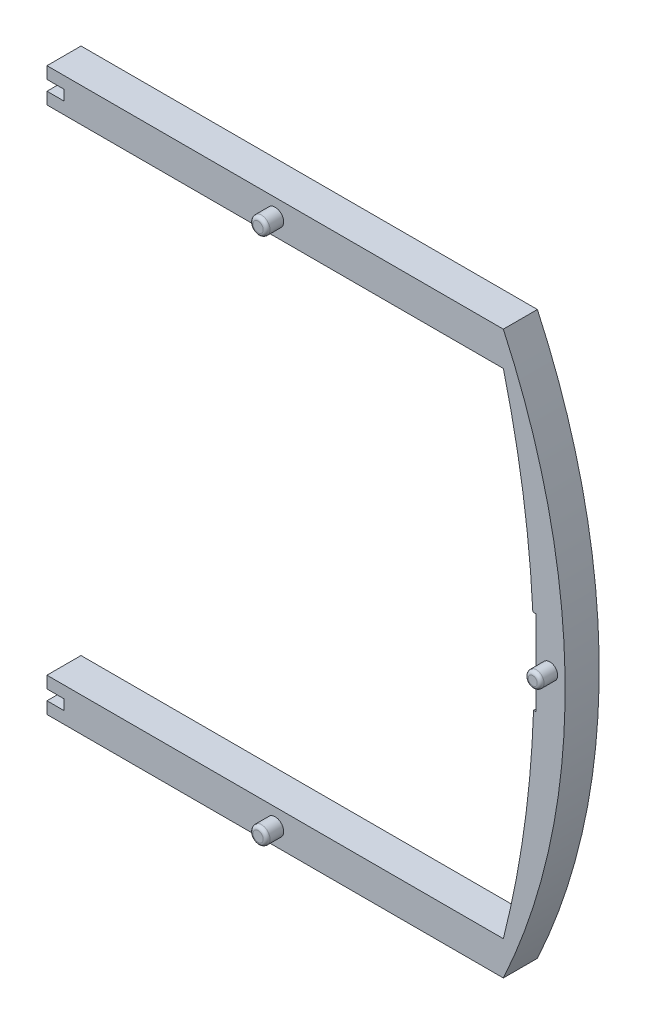
ISO-10303-21;
HEADER;
FILE_DESCRIPTION(('STEP AP214'),'2;1');
FILE_NAME('part.step','',(''),(''),'','','');
FILE_SCHEMA(('AUTOMOTIVE_DESIGN { 1 0 10303 214 1 1 1 1 }'));
ENDSEC;
DATA;
#1=APPLICATION_CONTEXT('core data for automotive mechanical design processes');
#2=APPLICATION_PROTOCOL_DEFINITION('international standard','automotive_design',2000,#1);
#3=PRODUCT_CONTEXT('',#1,'mechanical');
#4=PRODUCT('Part','Part','',(#3));
#5=PRODUCT_RELATED_PRODUCT_CATEGORY('part','',(#4));
#6=PRODUCT_DEFINITION_FORMATION('','',#4);
#7=PRODUCT_DEFINITION_CONTEXT('part definition',#1,'design');
#8=PRODUCT_DEFINITION('design','',#6,#7);
#9=PRODUCT_DEFINITION_SHAPE('','',#8);
#10=(LENGTH_UNIT() NAMED_UNIT(*) SI_UNIT(.MILLI.,.METRE.));
#11=(NAMED_UNIT(*) PLANE_ANGLE_UNIT() SI_UNIT($,.RADIAN.));
#12=(NAMED_UNIT(*) SI_UNIT($,.STERADIAN.) SOLID_ANGLE_UNIT());
#13=UNCERTAINTY_MEASURE_WITH_UNIT(LENGTH_MEASURE(1.E-05),#10,'distance_accuracy_value','');
#14=(GEOMETRIC_REPRESENTATION_CONTEXT(3) GLOBAL_UNCERTAINTY_ASSIGNED_CONTEXT((#13)) GLOBAL_UNIT_ASSIGNED_CONTEXT((#10,
#11,#12)) REPRESENTATION_CONTEXT('',''));
#15=CARTESIAN_POINT('',(0.,0.,0.));
#16=DIRECTION('',(0.,0.,1.));
#17=DIRECTION('',(1.,0.,0.));
#18=AXIS2_PLACEMENT_3D('',#15,#16,#17);
#19=CARTESIAN_POINT('',(0.,49.0251440135661,10.));
#20=DIRECTION('',(0.,1.,0.));
#21=DIRECTION('',(-1.,0.,0.));
#22=AXIS2_PLACEMENT_3D('',#19,#20,#21);
#23=PLANE('',#22);
#24=DIRECTION('',(1.,0.,0.));
#25=VECTOR('',#24,1.);
#26=CARTESIAN_POINT('',(0.,49.0251440135661,0.));
#27=LINE('',#26,#25);
#28=CARTESIAN_POINT('',(-18.7759866121896,49.0251440135661,0.));
#29=VERTEX_POINT('',#28);
#30=CARTESIAN_POINT('',(-13.7759866121896,49.0251440135661,0.));
#31=VERTEX_POINT('',#30);
#32=EDGE_CURVE('E230',#29,#31,#27,.T.);
#33=ORIENTED_EDGE('',*,*,#32,.T.);
#34=DIRECTION('',(0.,0.,-1.));
#35=VECTOR('',#34,1.);
#36=CARTESIAN_POINT('',(-13.7759866121896,49.0251440135661,10.));
#37=LINE('',#36,#35);
#38=CARTESIAN_POINT('',(-13.7759866121896,49.0251440135661,10.));
#39=VERTEX_POINT('',#38);
#40=EDGE_CURVE('E211',#39,#31,#37,.T.);
#41=ORIENTED_EDGE('',*,*,#40,.F.);
#42=DIRECTION('',(1.,0.,0.));
#43=VECTOR('',#42,1.);
#44=CARTESIAN_POINT('',(0.,49.0251440135661,10.));
#45=LINE('',#44,#43);
#46=CARTESIAN_POINT('',(-18.7759866121896,49.0251440135661,10.));
#47=VERTEX_POINT('',#46);
#48=EDGE_CURVE('E218',#47,#39,#45,.T.);
#49=ORIENTED_EDGE('',*,*,#48,.F.);
#50=DIRECTION('',(0.,0.,-1.));
#51=VECTOR('',#50,1.);
#52=CARTESIAN_POINT('',(-18.7759866121896,49.0251440135661,10.));
#53=LINE('',#52,#51);
#54=EDGE_CURVE('E351',#47,#29,#53,.T.);
#55=ORIENTED_EDGE('',*,*,#54,.T.);
#56=EDGE_LOOP('',(#33,#41,#49,#55));
#57=FACE_BOUND('',#56,.T.);
#58=ADVANCED_FACE('F35',(#57),#23,.F.);
#59=CARTESIAN_POINT('',(-13.7759866121896,0.,10.));
#60=DIRECTION('',(1.,0.,0.));
#61=DIRECTION('',(0.,0.,-1.));
#62=AXIS2_PLACEMENT_3D('',#59,#60,#61);
#63=PLANE('',#62);
#64=DIRECTION('',(0.,-1.,0.));
#65=VECTOR('',#64,1.);
#66=CARTESIAN_POINT('',(-13.7759866121896,0.,0.));
#67=LINE('',#66,#65);
#68=CARTESIAN_POINT('',(-13.7759866121896,46.0251440135661,0.));
#69=VERTEX_POINT('',#68);
#70=EDGE_CURVE('E353',#31,#69,#67,.T.);
#71=ORIENTED_EDGE('',*,*,#70,.T.);
#72=DIRECTION('',(0.,0.,-1.));
#73=VECTOR('',#72,1.);
#74=CARTESIAN_POINT('',(-13.7759866121896,46.0251440135661,10.));
#75=LINE('',#74,#73);
#76=CARTESIAN_POINT('',(-13.7759866121896,46.0251440135661,10.));
#77=VERTEX_POINT('',#76);
#78=EDGE_CURVE('E213',#77,#69,#75,.T.);
#79=ORIENTED_EDGE('',*,*,#78,.F.);
#80=DIRECTION('',(0.,-1.,0.));
#81=VECTOR('',#80,1.);
#82=CARTESIAN_POINT('',(-13.7759866121896,0.,10.));
#83=LINE('',#82,#81);
#84=EDGE_CURVE('E206',#39,#77,#83,.T.);
#85=ORIENTED_EDGE('',*,*,#84,.F.);
#86=ORIENTED_EDGE('',*,*,#40,.T.);
#87=EDGE_LOOP('',(#71,#79,#85,#86));
#88=FACE_BOUND('',#87,.T.);
#89=ADVANCED_FACE('F209',(#88),#63,.F.);
#90=CARTESIAN_POINT('',(0.,46.0251440135661,10.));
#91=DIRECTION('',(0.,1.,0.));
#92=DIRECTION('',(0.,0.,1.));
#93=AXIS2_PLACEMENT_3D('',#90,#91,#92);
#94=PLANE('',#93);
#95=DIRECTION('',(1.,0.,0.));
#96=VECTOR('',#95,1.);
#97=CARTESIAN_POINT('',(0.,46.0251440135661,0.));
#98=LINE('',#97,#96);
#99=CARTESIAN_POINT('',(-18.7759866121896,46.0251440135661,0.));
#100=VERTEX_POINT('',#99);
#101=EDGE_CURVE('E355',#100,#69,#98,.T.);
#102=ORIENTED_EDGE('',*,*,#101,.F.);
#103=DIRECTION('',(0.,0.,-1.));
#104=VECTOR('',#103,1.);
#105=CARTESIAN_POINT('',(-18.7759866121896,46.0251440135661,10.));
#106=LINE('',#105,#104);
#107=CARTESIAN_POINT('',(-18.7759866121896,46.0251440135661,10.));
#108=VERTEX_POINT('',#107);
#109=EDGE_CURVE('E236',#108,#100,#106,.T.);
#110=ORIENTED_EDGE('',*,*,#109,.F.);
#111=DIRECTION('',(1.,0.,0.));
#112=VECTOR('',#111,1.);
#113=CARTESIAN_POINT('',(0.,46.0251440135661,10.));
#114=LINE('',#113,#112);
#115=EDGE_CURVE('E217',#108,#77,#114,.T.);
#116=ORIENTED_EDGE('',*,*,#115,.T.);
#117=ORIENTED_EDGE('',*,*,#78,.T.);
#118=EDGE_LOOP('',(#102,#110,#116,#117));
#119=FACE_BOUND('',#118,.T.);
#120=ADVANCED_FACE('F435',(#119),#94,.T.);
#121=CARTESIAN_POINT('',(-18.7759866121896,0.,10.));
#122=DIRECTION('',(-1.,0.,0.));
#123=DIRECTION('',(0.,0.,1.));
#124=AXIS2_PLACEMENT_3D('',#121,#122,#123);
#125=PLANE('',#124);
#126=DIRECTION('',(0.,1.,0.));
#127=VECTOR('',#126,1.);
#128=CARTESIAN_POINT('',(-18.7759866121896,0.,0.));
#129=LINE('',#128,#127);
#130=CARTESIAN_POINT('',(-18.7759866121896,42.5251440135662,0.));
#131=VERTEX_POINT('',#130);
#132=EDGE_CURVE('E358',#131,#100,#129,.T.);
#133=ORIENTED_EDGE('',*,*,#132,.F.);
#134=DIRECTION('',(0.,0.,-1.));
#135=VECTOR('',#134,1.);
#136=CARTESIAN_POINT('',(-18.7759866121896,42.5251440135662,10.));
#137=LINE('',#136,#135);
#138=CARTESIAN_POINT('',(-18.7759866121896,42.5251440135662,10.));
#139=VERTEX_POINT('',#138);
#140=EDGE_CURVE('E428',#139,#131,#137,.T.);
#141=ORIENTED_EDGE('',*,*,#140,.F.);
#142=DIRECTION('',(0.,1.,0.));
#143=VECTOR('',#142,1.);
#144=CARTESIAN_POINT('',(-18.7759866121896,0.,10.));
#145=LINE('',#144,#143);
#146=EDGE_CURVE('E307',#139,#108,#145,.T.);
#147=ORIENTED_EDGE('',*,*,#146,.T.);
#148=ORIENTED_EDGE('',*,*,#109,.T.);
#149=EDGE_LOOP('',(#133,#141,#147,#148));
#150=FACE_BOUND('',#149,.T.);
#151=ADVANCED_FACE('F432',(#150),#125,.T.);
#152=CARTESIAN_POINT('',(0.,42.5251440135662,10.));
#153=DIRECTION('',(0.,1.,0.));
#154=DIRECTION('',(0.,0.,1.));
#155=AXIS2_PLACEMENT_3D('',#152,#153,#154);
#156=PLANE('',#155);
#157=DIRECTION('',(1.,0.,0.));
#158=VECTOR('',#157,1.);
#159=CARTESIAN_POINT('',(0.,42.5251440135662,0.));
#160=LINE('',#159,#158);
#161=CARTESIAN_POINT('',(115.22401338781,42.5251440135662,0.));
#162=VERTEX_POINT('',#161);
#163=EDGE_CURVE('E361',#131,#162,#160,.T.);
#164=ORIENTED_EDGE('',*,*,#163,.T.);
#165=DIRECTION('',(0.,0.,-1.));
#166=VECTOR('',#165,1.);
#167=CARTESIAN_POINT('',(115.22401338781,42.5251440135662,10.));
#168=LINE('',#167,#166);
#169=CARTESIAN_POINT('',(115.22401338781,42.5251440135662,10.));
#170=VERTEX_POINT('',#169);
#171=EDGE_CURVE('E426',#170,#162,#168,.T.);
#172=ORIENTED_EDGE('',*,*,#171,.F.);
#173=DIRECTION('',(1.,0.,0.));
#174=VECTOR('',#173,1.);
#175=CARTESIAN_POINT('',(0.,42.5251440135662,10.));
#176=LINE('',#175,#174);
#177=EDGE_CURVE('E310',#139,#170,#176,.T.);
#178=ORIENTED_EDGE('',*,*,#177,.F.);
#179=ORIENTED_EDGE('',*,*,#140,.T.);
#180=EDGE_LOOP('',(#164,#172,#178,#179));
#181=FACE_BOUND('',#180,.T.);
#182=ADVANCED_FACE('F439',(#181),#156,.F.);
#183=CARTESIAN_POINT('',(-171.126393016435,-29.9748559864339,10.));
#184=DIRECTION('',(0.,0.,-1.));
#185=DIRECTION('',(-1.,0.,0.));
#186=AXIS2_PLACEMENT_3D('',#183,#184,#185);
#187=CYLINDRICAL_SURFACE('',#186,295.385858239484);
#188=CARTESIAN_POINT('',(-171.126393016435,-29.9748559864339,0.));
#189=DIRECTION('',(0.,0.,1.));
#190=DIRECTION('',(1.,0.,0.));
#191=AXIS2_PLACEMENT_3D('',#188,#189,#190);
#192=CIRCLE('',#191,295.385858239484);
#193=CARTESIAN_POINT('',(123.882639825974,-15.0592336640898,0.));
#194=VERTEX_POINT('',#193);
#195=EDGE_CURVE('E364',#194,#162,#192,.T.);
#196=ORIENTED_EDGE('',*,*,#195,.F.);
#197=DIRECTION('',(0.,0.,-1.));
#198=VECTOR('',#197,1.);
#199=CARTESIAN_POINT('',(123.882639825974,-15.0592336640898,10.));
#200=LINE('',#199,#198);
#201=CARTESIAN_POINT('',(123.882639825974,-15.0592336640898,2.));
#202=VERTEX_POINT('',#201);
#203=EDGE_CURVE('E301',#194,#202,#200,.F.);
#204=ORIENTED_EDGE('',*,*,#203,.T.);
#205=DIRECTION('',(0.,0.,-1.));
#206=VECTOR('',#205,1.);
#207=CARTESIAN_POINT('',(123.882639825974,-15.0592336640898,10.));
#208=LINE('',#207,#206);
#209=CARTESIAN_POINT('',(123.882639825974,-15.0592336640898,10.));
#210=VERTEX_POINT('',#209);
#211=EDGE_CURVE('E423',#210,#202,#208,.T.);
#212=ORIENTED_EDGE('',*,*,#211,.F.);
#213=CARTESIAN_POINT('',(-171.126393016435,-29.9748559864339,10.));
#214=DIRECTION('',(0.,0.,1.));
#215=DIRECTION('',(1.,0.,0.));
#216=AXIS2_PLACEMENT_3D('',#213,#214,#215);
#217=CIRCLE('',#216,295.385858239484);
#218=EDGE_CURVE('E312',#210,#170,#217,.T.);
#219=ORIENTED_EDGE('',*,*,#218,.T.);
#220=ORIENTED_EDGE('',*,*,#171,.T.);
#221=EDGE_LOOP('',(#196,#204,#212,#219,#220));
#222=FACE_BOUND('',#221,.T.);
#223=ADVANCED_FACE('F552',(#222),#187,.F.);
#224=CARTESIAN_POINT('',(0.,-15.0592336640898,10.));
#225=DIRECTION('',(0.,-1.,0.));
#226=DIRECTION('',(0.,0.,-1.));
#227=AXIS2_PLACEMENT_3D('',#224,#225,#226);
#228=PLANE('',#227);
#229=DIRECTION('',(-1.,0.,0.));
#230=VECTOR('',#229,1.);
#231=CARTESIAN_POINT('',(124.791681136578,-15.0592336640898,2.));
#232=LINE('',#231,#230);
#233=CARTESIAN_POINT('',(124.791681136578,-15.0592336640898,2.));
#234=VERTEX_POINT('',#233);
#235=EDGE_CURVE('E293',#234,#202,#232,.T.);
#236=ORIENTED_EDGE('',*,*,#235,.F.);
#237=DIRECTION('',(0.,0.,-1.));
#238=VECTOR('',#237,1.);
#239=CARTESIAN_POINT('',(124.791681136578,-15.0592336640898,10.));
#240=LINE('',#239,#238);
#241=CARTESIAN_POINT('',(124.791681136578,-15.0592336640898,10.));
#242=VERTEX_POINT('',#241);
#243=EDGE_CURVE('E420',#242,#234,#240,.T.);
#244=ORIENTED_EDGE('',*,*,#243,.F.);
#245=DIRECTION('',(-1.,0.,0.));
#246=VECTOR('',#245,1.);
#247=CARTESIAN_POINT('',(0.,-15.0592336640898,10.));
#248=LINE('',#247,#246);
#249=EDGE_CURVE('E315',#242,#210,#248,.T.);
#250=ORIENTED_EDGE('',*,*,#249,.T.);
#251=ORIENTED_EDGE('',*,*,#211,.T.);
#252=EDGE_LOOP('',(#236,#244,#250,#251));
#253=FACE_BOUND('',#252,.T.);
#254=ADVANCED_FACE('F445',(#253),#228,.T.);
#255=CARTESIAN_POINT('',(124.791681136578,0.,10.));
#256=DIRECTION('',(1.,0.,0.));
#257=DIRECTION('',(0.,0.,-1.));
#258=AXIS2_PLACEMENT_3D('',#255,#256,#257);
#259=PLANE('',#258);
#260=ORIENTED_EDGE('',*,*,#243,.T.);
#261=DIRECTION('',(0.,-1.,0.));
#262=VECTOR('',#261,1.);
#263=CARTESIAN_POINT('',(124.791681136578,-15.0592336640898,2.));
#264=LINE('',#263,#262);
#265=CARTESIAN_POINT('',(124.791681136578,-39.9748559864338,2.));
#266=VERTEX_POINT('',#265);
#267=EDGE_CURVE('E298',#234,#266,#264,.T.);
#268=ORIENTED_EDGE('',*,*,#267,.T.);
#269=DIRECTION('',(0.,0.,-1.));
#270=VECTOR('',#269,1.);
#271=CARTESIAN_POINT('',(124.791681136578,-39.9748559864338,10.));
#272=LINE('',#271,#270);
#273=CARTESIAN_POINT('',(124.791681136578,-39.9748559864338,10.));
#274=VERTEX_POINT('',#273);
#275=EDGE_CURVE('E417',#274,#266,#272,.T.);
#276=ORIENTED_EDGE('',*,*,#275,.F.);
#277=DIRECTION('',(0.,-1.,0.));
#278=VECTOR('',#277,1.);
#279=CARTESIAN_POINT('',(124.791681136578,0.,10.));
#280=LINE('',#279,#278);
#281=EDGE_CURVE('E319',#242,#274,#280,.T.);
#282=ORIENTED_EDGE('',*,*,#281,.F.);
#283=EDGE_LOOP('',(#260,#268,#276,#282));
#284=FACE_BOUND('',#283,.T.);
#285=ADVANCED_FACE('F451',(#284),#259,.F.);
#286=CARTESIAN_POINT('',(0.,-39.9748559864338,10.));
#287=DIRECTION('',(0.,-1.,0.));
#288=DIRECTION('',(0.,0.,-1.));
#289=AXIS2_PLACEMENT_3D('',#286,#287,#288);
#290=PLANE('',#289);
#291=ORIENTED_EDGE('',*,*,#275,.T.);
#292=DIRECTION('',(-1.,0.,0.));
#293=VECTOR('',#292,1.);
#294=CARTESIAN_POINT('',(124.791681136578,-39.9748559864338,2.));
#295=LINE('',#294,#293);
#296=CARTESIAN_POINT('',(124.090146574213,-39.9748559864338,2.));
#297=VERTEX_POINT('',#296);
#298=EDGE_CURVE('E460',#266,#297,#295,.T.);
#299=ORIENTED_EDGE('',*,*,#298,.T.);
#300=DIRECTION('',(0.,0.,-1.));
#301=VECTOR('',#300,1.);
#302=CARTESIAN_POINT('',(124.090146574213,-39.9748559864338,10.));
#303=LINE('',#302,#301);
#304=CARTESIAN_POINT('',(124.090146574213,-39.9748559864338,10.));
#305=VERTEX_POINT('',#304);
#306=EDGE_CURVE('E414',#305,#297,#303,.T.);
#307=ORIENTED_EDGE('',*,*,#306,.F.);
#308=DIRECTION('',(-1.,0.,0.));
#309=VECTOR('',#308,1.);
#310=CARTESIAN_POINT('',(0.,-39.9748559864338,10.));
#311=LINE('',#310,#309);
#312=EDGE_CURVE('E321',#274,#305,#311,.T.);
#313=ORIENTED_EDGE('',*,*,#312,.F.);
#314=EDGE_LOOP('',(#291,#299,#307,#313));
#315=FACE_BOUND('',#314,.T.);
#316=ADVANCED_FACE('F458',(#315),#290,.F.);
#317=CARTESIAN_POINT('',(115.22401338781,-102.474855986434,0.));
#318=VERTEX_POINT('',#317);
#319=CARTESIAN_POINT('',(124.090146574213,-39.9748559864338,0.));
#320=VERTEX_POINT('',#319);
#321=EDGE_CURVE('E290',#318,#320,#192,.T.);
#322=ORIENTED_EDGE('',*,*,#321,.F.);
#323=DIRECTION('',(0.,0.,-1.));
#324=VECTOR('',#323,1.);
#325=CARTESIAN_POINT('',(115.22401338781,-102.474855986434,10.));
#326=LINE('',#325,#324);
#327=CARTESIAN_POINT('',(115.22401338781,-102.474855986434,10.));
#328=VERTEX_POINT('',#327);
#329=EDGE_CURVE('E412',#328,#318,#326,.T.);
#330=ORIENTED_EDGE('',*,*,#329,.F.);
#331=EDGE_CURVE('E316',#328,#305,#217,.T.);
#332=ORIENTED_EDGE('',*,*,#331,.T.);
#333=ORIENTED_EDGE('',*,*,#306,.T.);
#334=DIRECTION('',(0.,0.,-1.));
#335=VECTOR('',#334,1.);
#336=CARTESIAN_POINT('',(124.090146574213,-39.9748559864338,10.));
#337=LINE('',#336,#335);
#338=EDGE_CURVE('E277',#320,#297,#337,.F.);
#339=ORIENTED_EDGE('',*,*,#338,.F.);
#340=EDGE_LOOP('',(#322,#330,#332,#333,#339));
#341=FACE_BOUND('',#340,.T.);
#342=ADVANCED_FACE('F462',(#341),#187,.F.);
#343=CARTESIAN_POINT('',(0.,-102.474855986434,10.));
#344=DIRECTION('',(0.,1.,0.));
#345=DIRECTION('',(-1.,0.,0.));
#346=AXIS2_PLACEMENT_3D('',#343,#344,#345);
#347=PLANE('',#346);
#348=DIRECTION('',(1.,0.,0.));
#349=VECTOR('',#348,1.);
#350=CARTESIAN_POINT('',(0.,-102.474855986434,0.));
#351=LINE('',#350,#349);
#352=CARTESIAN_POINT('',(-18.7877563106144,-102.474855986434,0.));
#353=VERTEX_POINT('',#352);
#354=EDGE_CURVE('E367',#353,#318,#351,.T.);
#355=ORIENTED_EDGE('',*,*,#354,.F.);
#356=DIRECTION('',(0.,0.,-1.));
#357=VECTOR('',#356,1.);
#358=CARTESIAN_POINT('',(-18.7877563106144,-102.474855986434,10.));
#359=LINE('',#358,#357);
#360=CARTESIAN_POINT('',(-18.7877563106144,-102.474855986434,10.));
#361=VERTEX_POINT('',#360);
#362=EDGE_CURVE('E410',#361,#353,#359,.T.);
#363=ORIENTED_EDGE('',*,*,#362,.F.);
#364=DIRECTION('',(1.,0.,0.));
#365=VECTOR('',#364,1.);
#366=CARTESIAN_POINT('',(0.,-102.474855986434,10.));
#367=LINE('',#366,#365);
#368=EDGE_CURVE('E323',#361,#328,#367,.T.);
#369=ORIENTED_EDGE('',*,*,#368,.T.);
#370=ORIENTED_EDGE('',*,*,#329,.T.);
#371=EDGE_LOOP('',(#355,#363,#369,#370));
#372=FACE_BOUND('',#371,.T.);
#373=ADVANCED_FACE('F465',(#372),#347,.T.);
#374=CARTESIAN_POINT('',(-19.1321394317428,-0.0643370032374166,10.));
#375=DIRECTION('',(0.999994345933626,0.00336275196515592,0.));
#376=DIRECTION('',(-0.00336275196515592,0.999994345933626,0.));
#377=AXIS2_PLACEMENT_3D('',#374,#375,#376);
#378=PLANE('',#377);
#379=DIRECTION('',(0.00336275196515592,-0.999994345933626,0.));
#380=VECTOR('',#379,1.);
#381=CARTESIAN_POINT('',(-19.1321394317428,-0.0643370032374166,0.));
#382=LINE('',#381,#380);
#383=CARTESIAN_POINT('',(-18.7759866121897,-105.974855986434,0.));
#384=VERTEX_POINT('',#383);
#385=EDGE_CURVE('E369',#353,#384,#382,.T.);
#386=ORIENTED_EDGE('',*,*,#385,.T.);
#387=DIRECTION('',(0.,0.,-1.));
#388=VECTOR('',#387,1.);
#389=CARTESIAN_POINT('',(-18.7759866121897,-105.974855986434,10.));
#390=LINE('',#389,#388);
#391=CARTESIAN_POINT('',(-18.7759866121897,-105.974855986434,10.));
#392=VERTEX_POINT('',#391);
#393=EDGE_CURVE('E407',#392,#384,#390,.T.);
#394=ORIENTED_EDGE('',*,*,#393,.F.);
#395=DIRECTION('',(0.00336275196515592,-0.999994345933626,0.));
#396=VECTOR('',#395,1.);
#397=CARTESIAN_POINT('',(-19.1321394317428,-0.0643370032374166,10.));
#398=LINE('',#397,#396);
#399=EDGE_CURVE('E326',#361,#392,#398,.T.);
#400=ORIENTED_EDGE('',*,*,#399,.F.);
#401=ORIENTED_EDGE('',*,*,#362,.T.);
#402=EDGE_LOOP('',(#386,#394,#400,#401));
#403=FACE_BOUND('',#402,.T.);
#404=ADVANCED_FACE('F471',(#403),#378,.F.);
#405=CARTESIAN_POINT('',(0.,-105.974855986434,10.));
#406=DIRECTION('',(0.,1.,0.));
#407=DIRECTION('',(0.,0.,1.));
#408=AXIS2_PLACEMENT_3D('',#405,#406,#407);
#409=PLANE('',#408);
#410=DIRECTION('',(1.,0.,0.));
#411=VECTOR('',#410,1.);
#412=CARTESIAN_POINT('',(0.,-105.974855986434,0.));
#413=LINE('',#412,#411);
#414=CARTESIAN_POINT('',(-13.7759866121897,-105.974855986434,0.));
#415=VERTEX_POINT('',#414);
#416=EDGE_CURVE('E371',#384,#415,#413,.T.);
#417=ORIENTED_EDGE('',*,*,#416,.T.);
#418=DIRECTION('',(0.,0.,-1.));
#419=VECTOR('',#418,1.);
#420=CARTESIAN_POINT('',(-13.7759866121897,-105.974855986434,10.));
#421=LINE('',#420,#419);
#422=CARTESIAN_POINT('',(-13.7759866121897,-105.974855986434,10.));
#423=VERTEX_POINT('',#422);
#424=EDGE_CURVE('E404',#423,#415,#421,.T.);
#425=ORIENTED_EDGE('',*,*,#424,.F.);
#426=DIRECTION('',(1.,0.,0.));
#427=VECTOR('',#426,1.);
#428=CARTESIAN_POINT('',(0.,-105.974855986434,10.));
#429=LINE('',#428,#427);
#430=EDGE_CURVE('E328',#392,#423,#429,.T.);
#431=ORIENTED_EDGE('',*,*,#430,.F.);
#432=ORIENTED_EDGE('',*,*,#393,.T.);
#433=EDGE_LOOP('',(#417,#425,#431,#432));
#434=FACE_BOUND('',#433,.T.);
#435=ADVANCED_FACE('F475',(#434),#409,.F.);
#436=CARTESIAN_POINT('',(-13.7759866121897,0.,10.));
#437=DIRECTION('',(1.,0.,0.));
#438=DIRECTION('',(0.,0.,-1.));
#439=AXIS2_PLACEMENT_3D('',#436,#437,#438);
#440=PLANE('',#439);
#441=DIRECTION('',(0.,-1.,0.));
#442=VECTOR('',#441,1.);
#443=CARTESIAN_POINT('',(-13.7759866121897,0.,0.));
#444=LINE('',#443,#442);
#445=CARTESIAN_POINT('',(-13.7759866121897,-108.974855986434,0.));
#446=VERTEX_POINT('',#445);
#447=EDGE_CURVE('E373',#415,#446,#444,.T.);
#448=ORIENTED_EDGE('',*,*,#447,.T.);
#449=DIRECTION('',(0.,0.,-1.));
#450=VECTOR('',#449,1.);
#451=CARTESIAN_POINT('',(-13.7759866121897,-108.974855986434,10.));
#452=LINE('',#451,#450);
#453=CARTESIAN_POINT('',(-13.7759866121897,-108.974855986434,10.));
#454=VERTEX_POINT('',#453);
#455=EDGE_CURVE('E402',#454,#446,#452,.T.);
#456=ORIENTED_EDGE('',*,*,#455,.F.);
#457=DIRECTION('',(0.,-1.,0.));
#458=VECTOR('',#457,1.);
#459=CARTESIAN_POINT('',(-13.7759866121897,0.,10.));
#460=LINE('',#459,#458);
#461=EDGE_CURVE('E330',#423,#454,#460,.T.);
#462=ORIENTED_EDGE('',*,*,#461,.F.);
#463=ORIENTED_EDGE('',*,*,#424,.T.);
#464=EDGE_LOOP('',(#448,#456,#462,#463));
#465=FACE_BOUND('',#464,.T.);
#466=ADVANCED_FACE('F480',(#465),#440,.F.);
#467=CARTESIAN_POINT('',(3.02465985553373E-13,-108.974855986434,10.));
#468=DIRECTION('',(0.,1.,0.));
#469=DIRECTION('',(-1.,0.,0.));
#470=AXIS2_PLACEMENT_3D('',#467,#468,#469);
#471=PLANE('',#470);
#472=DIRECTION('',(1.,0.,0.));
#473=VECTOR('',#472,1.);
#474=CARTESIAN_POINT('',(3.02465985553373E-13,-108.974855986434,0.));
#475=LINE('',#474,#473);
#476=CARTESIAN_POINT('',(-18.7759866121897,-108.974855986434,0.));
#477=VERTEX_POINT('',#476);
#478=EDGE_CURVE('E376',#477,#446,#475,.T.);
#479=ORIENTED_EDGE('',*,*,#478,.F.);
#480=DIRECTION('',(0.,0.,-1.));
#481=VECTOR('',#480,1.);
#482=CARTESIAN_POINT('',(-18.7759866121897,-108.974855986434,10.));
#483=LINE('',#482,#481);
#484=CARTESIAN_POINT('',(-18.7759866121897,-108.974855986434,10.));
#485=VERTEX_POINT('',#484);
#486=EDGE_CURVE('E400',#485,#477,#483,.T.);
#487=ORIENTED_EDGE('',*,*,#486,.F.);
#488=DIRECTION('',(1.,0.,0.));
#489=VECTOR('',#488,1.);
#490=CARTESIAN_POINT('',(3.02465985553373E-13,-108.974855986434,10.));
#491=LINE('',#490,#489);
#492=EDGE_CURVE('E332',#485,#454,#491,.T.);
#493=ORIENTED_EDGE('',*,*,#492,.T.);
#494=ORIENTED_EDGE('',*,*,#455,.T.);
#495=EDGE_LOOP('',(#479,#487,#493,#494));
#496=FACE_BOUND('',#495,.T.);
#497=ADVANCED_FACE('F487',(#496),#471,.T.);
#498=CARTESIAN_POINT('',(-18.4093209522831,0.0619063302319762,10.));
#499=DIRECTION('',(0.999994345933626,-0.00336275196515593,0.));
#500=DIRECTION('',(0.00336275196515593,0.999994345933626,0.));
#501=AXIS2_PLACEMENT_3D('',#498,#499,#500);
#502=PLANE('',#501);
#503=DIRECTION('',(-0.00336275196515593,-0.999994345933626,0.));
#504=VECTOR('',#503,1.);
#505=CARTESIAN_POINT('',(-18.4093209522831,0.0619063302319762,0.));
#506=LINE('',#505,#504);
#507=CARTESIAN_POINT('',(-18.7877563106144,-112.474855986434,0.));
#508=VERTEX_POINT('',#507);
#509=EDGE_CURVE('E379',#477,#508,#506,.T.);
#510=ORIENTED_EDGE('',*,*,#509,.T.);
#511=DIRECTION('',(0.,0.,-1.));
#512=VECTOR('',#511,1.);
#513=CARTESIAN_POINT('',(-18.7877563106144,-112.474855986434,10.));
#514=LINE('',#513,#512);
#515=CARTESIAN_POINT('',(-18.7877563106144,-112.474855986434,10.));
#516=VERTEX_POINT('',#515);
#517=EDGE_CURVE('E398',#516,#508,#514,.T.);
#518=ORIENTED_EDGE('',*,*,#517,.F.);
#519=DIRECTION('',(-0.00336275196515593,-0.999994345933626,0.));
#520=VECTOR('',#519,1.);
#521=CARTESIAN_POINT('',(-18.4093209522831,0.0619063302319762,10.));
#522=LINE('',#521,#520);
#523=EDGE_CURVE('E335',#485,#516,#522,.T.);
#524=ORIENTED_EDGE('',*,*,#523,.F.);
#525=ORIENTED_EDGE('',*,*,#486,.T.);
#526=EDGE_LOOP('',(#510,#518,#524,#525));
#527=FACE_BOUND('',#526,.T.);
#528=ADVANCED_FACE('F490',(#527),#502,.F.);
#529=CARTESIAN_POINT('',(0.,-112.474855986434,10.));
#530=DIRECTION('',(0.,-1.,0.));
#531=DIRECTION('',(1.,0.,0.));
#532=AXIS2_PLACEMENT_3D('',#529,#530,#531);
#533=PLANE('',#532);
#534=DIRECTION('',(-1.,0.,0.));
#535=VECTOR('',#534,1.);
#536=CARTESIAN_POINT('',(0.,-112.474855986434,0.));
#537=LINE('',#536,#535);
#538=CARTESIAN_POINT('',(115.22401338781,-112.474855986434,0.));
#539=VERTEX_POINT('',#538);
#540=EDGE_CURVE('E382',#539,#508,#537,.T.);
#541=ORIENTED_EDGE('',*,*,#540,.F.);
#542=DIRECTION('',(0.,0.,-1.));
#543=VECTOR('',#542,1.);
#544=CARTESIAN_POINT('',(115.22401338781,-112.474855986434,10.));
#545=LINE('',#544,#543);
#546=CARTESIAN_POINT('',(115.22401338781,-112.474855986434,10.));
#547=VERTEX_POINT('',#546);
#548=EDGE_CURVE('E396',#547,#539,#545,.T.);
#549=ORIENTED_EDGE('',*,*,#548,.F.);
#550=DIRECTION('',(-1.,0.,0.));
#551=VECTOR('',#550,1.);
#552=CARTESIAN_POINT('',(0.,-112.474855986434,10.));
#553=LINE('',#552,#551);
#554=EDGE_CURVE('E337',#547,#516,#553,.T.);
#555=ORIENTED_EDGE('',*,*,#554,.T.);
#556=ORIENTED_EDGE('',*,*,#517,.T.);
#557=EDGE_LOOP('',(#541,#549,#555,#556));
#558=FACE_BOUND('',#557,.T.);
#559=ADVANCED_FACE('F493',(#558),#533,.T.);
#560=CARTESIAN_POINT('',(-63.2147688535979,-29.9748559864339,10.));
#561=DIRECTION('',(0.,0.,-1.));
#562=DIRECTION('',(-1.,0.,0.));
#563=AXIS2_PLACEMENT_3D('',#560,#561,#562);
#564=CYLINDRICAL_SURFACE('',#563,196.587509796011);
#565=CARTESIAN_POINT('',(-63.2147688535979,-29.9748559864339,0.));
#566=DIRECTION('',(0.,0.,1.));
#567=DIRECTION('',(1.,0.,0.));
#568=AXIS2_PLACEMENT_3D('',#565,#566,#567);
#569=CIRCLE('',#568,196.587509796011);
#570=CARTESIAN_POINT('',(115.22401338781,52.5251440135662,0.));
#571=VERTEX_POINT('',#570);
#572=EDGE_CURVE('E385',#571,#539,#569,.F.);
#573=ORIENTED_EDGE('',*,*,#572,.F.);
#574=DIRECTION('',(0.,0.,-1.));
#575=VECTOR('',#574,1.);
#576=CARTESIAN_POINT('',(115.22401338781,52.5251440135662,10.));
#577=LINE('',#576,#575);
#578=CARTESIAN_POINT('',(115.22401338781,52.5251440135662,10.));
#579=VERTEX_POINT('',#578);
#580=EDGE_CURVE('E394',#579,#571,#577,.T.);
#581=ORIENTED_EDGE('',*,*,#580,.F.);
#582=CARTESIAN_POINT('',(-63.2147688535979,-29.9748559864339,10.));
#583=DIRECTION('',(0.,0.,1.));
#584=DIRECTION('',(1.,0.,0.));
#585=AXIS2_PLACEMENT_3D('',#582,#583,#584);
#586=CIRCLE('',#585,196.587509796011);
#587=EDGE_CURVE('E340',#579,#547,#586,.F.);
#588=ORIENTED_EDGE('',*,*,#587,.T.);
#589=ORIENTED_EDGE('',*,*,#548,.T.);
#590=EDGE_LOOP('',(#573,#581,#588,#589));
#591=FACE_BOUND('',#590,.T.);
#592=ADVANCED_FACE('F497',(#591),#564,.T.);
#593=CARTESIAN_POINT('',(0.,52.5251440135661,10.));
#594=DIRECTION('',(0.,-1.,0.));
#595=DIRECTION('',(1.,0.,0.));
#596=AXIS2_PLACEMENT_3D('',#593,#594,#595);
#597=PLANE('',#596);
#598=DIRECTION('',(-1.,0.,0.));
#599=VECTOR('',#598,1.);
#600=CARTESIAN_POINT('',(0.,52.5251440135661,0.));
#601=LINE('',#600,#599);
#602=CARTESIAN_POINT('',(-18.7759866121896,52.5251440135661,0.));
#603=VERTEX_POINT('',#602);
#604=EDGE_CURVE('E388',#571,#603,#601,.T.);
#605=ORIENTED_EDGE('',*,*,#604,.T.);
#606=DIRECTION('',(0.,0.,-1.));
#607=VECTOR('',#606,1.);
#608=CARTESIAN_POINT('',(-18.7759866121896,52.5251440135661,10.));
#609=LINE('',#608,#607);
#610=CARTESIAN_POINT('',(-18.7759866121896,52.5251440135661,10.));
#611=VERTEX_POINT('',#610);
#612=EDGE_CURVE('E392',#611,#603,#609,.T.);
#613=ORIENTED_EDGE('',*,*,#612,.F.);
#614=DIRECTION('',(-1.,0.,0.));
#615=VECTOR('',#614,1.);
#616=CARTESIAN_POINT('',(0.,52.5251440135661,10.));
#617=LINE('',#616,#615);
#618=EDGE_CURVE('E343',#579,#611,#617,.T.);
#619=ORIENTED_EDGE('',*,*,#618,.F.);
#620=ORIENTED_EDGE('',*,*,#580,.T.);
#621=EDGE_LOOP('',(#605,#613,#619,#620));
#622=FACE_BOUND('',#621,.T.);
#623=ADVANCED_FACE('F502',(#622),#597,.F.);
#624=EDGE_CURVE('E304',#29,#603,#129,.T.);
#625=ORIENTED_EDGE('',*,*,#624,.F.);
#626=ORIENTED_EDGE('',*,*,#54,.F.);
#627=EDGE_CURVE('E225',#47,#611,#145,.T.);
#628=ORIENTED_EDGE('',*,*,#627,.T.);
#629=ORIENTED_EDGE('',*,*,#612,.T.);
#630=EDGE_LOOP('',(#625,#626,#628,#629));
#631=FACE_BOUND('',#630,.T.);
#632=ADVANCED_FACE('F506',(#631),#125,.T.);
#633=CARTESIAN_POINT('',(0.,0.,10.));
#634=DIRECTION('',(0.,0.,1.));
#635=DIRECTION('',(1.,0.,0.));
#636=AXIS2_PLACEMENT_3D('',#633,#634,#635);
#637=PLANE('',#636);
#638=CARTESIAN_POINT('',(48.2240133878104,47.5251440135662,10.));
#639=DIRECTION('',(0.,0.,1.));
#640=DIRECTION('',(1.,0.,0.));
#641=AXIS2_PLACEMENT_3D('',#638,#639,#640);
#642=CIRCLE('',#641,2.5);
#643=CARTESIAN_POINT('',(50.7240133878104,47.5251440135662,10.));
#644=VERTEX_POINT('',#643);
#645=EDGE_CURVE('E227',#644,#644,#642,.T.);
#646=ORIENTED_EDGE('',*,*,#645,.F.);
#647=EDGE_LOOP('',(#646));
#648=FACE_BOUND('',#647,.T.);
#649=ORIENTED_EDGE('',*,*,#48,.T.);
#650=ORIENTED_EDGE('',*,*,#84,.T.);
#651=ORIENTED_EDGE('',*,*,#115,.F.);
#652=ORIENTED_EDGE('',*,*,#146,.F.);
#653=ORIENTED_EDGE('',*,*,#177,.T.);
#654=ORIENTED_EDGE('',*,*,#218,.F.);
#655=ORIENTED_EDGE('',*,*,#249,.F.);
#656=ORIENTED_EDGE('',*,*,#281,.T.);
#657=ORIENTED_EDGE('',*,*,#312,.T.);
#658=ORIENTED_EDGE('',*,*,#331,.F.);
#659=ORIENTED_EDGE('',*,*,#368,.F.);
#660=ORIENTED_EDGE('',*,*,#399,.T.);
#661=ORIENTED_EDGE('',*,*,#430,.T.);
#662=ORIENTED_EDGE('',*,*,#461,.T.);
#663=ORIENTED_EDGE('',*,*,#492,.F.);
#664=ORIENTED_EDGE('',*,*,#523,.T.);
#665=ORIENTED_EDGE('',*,*,#554,.F.);
#666=ORIENTED_EDGE('',*,*,#587,.F.);
#667=ORIENTED_EDGE('',*,*,#618,.T.);
#668=ORIENTED_EDGE('',*,*,#627,.F.);
#669=EDGE_LOOP('',(#649,#650,#651,#652,#653,#654,#655,#656,#657,#658,#659,#660,#661,#662,#663,
#664,#665,#666,#667,#668));
#670=FACE_BOUND('',#669,.T.);
#671=CARTESIAN_POINT('',(128.863881440581,-27.5592336640898,10.));
#672=DIRECTION('',(0.,0.,1.));
#673=DIRECTION('',(1.,0.,0.));
#674=AXIS2_PLACEMENT_3D('',#671,#672,#673);
#675=CIRCLE('',#674,2.31371444787891);
#676=CARTESIAN_POINT('',(131.17759588846,-27.5592336640898,10.));
#677=VERTEX_POINT('',#676);
#678=EDGE_CURVE('E345',#677,#677,#675,.T.);
#679=ORIENTED_EDGE('',*,*,#678,.F.);
#680=EDGE_LOOP('',(#679));
#681=FACE_BOUND('',#680,.T.);
#682=CARTESIAN_POINT('',(48.2240133878104,-107.474855986434,10.));
#683=DIRECTION('',(0.,0.,1.));
#684=DIRECTION('',(1.,0.,0.));
#685=AXIS2_PLACEMENT_3D('',#682,#683,#684);
#686=CIRCLE('',#685,2.5);
#687=CARTESIAN_POINT('',(50.7240133878104,-107.474855986434,10.));
#688=VERTEX_POINT('',#687);
#689=EDGE_CURVE('E348',#688,#688,#686,.T.);
#690=ORIENTED_EDGE('',*,*,#689,.F.);
#691=EDGE_LOOP('',(#690));
#692=FACE_BOUND('',#691,.T.);
#693=ADVANCED_FACE('F222',(#648,#670,#681,#692),#637,.T.);
#694=CARTESIAN_POINT('',(0.,0.,0.));
#695=DIRECTION('',(0.,0.,1.));
#696=DIRECTION('',(1.,0.,0.));
#697=AXIS2_PLACEMENT_3D('',#694,#695,#696);
#698=PLANE('',#697);
#699=DIRECTION('',(-1.,0.,0.));
#700=VECTOR('',#699,1.);
#701=CARTESIAN_POINT('',(124.791681136578,-39.9748559864338,0.));
#702=LINE('',#701,#700);
#703=CARTESIAN_POINT('',(122.291681136578,-39.9748559864338,0.));
#704=VERTEX_POINT('',#703);
#705=EDGE_CURVE('E285',#320,#704,#702,.T.);
#706=ORIENTED_EDGE('',*,*,#705,.T.);
#707=DIRECTION('',(0.,-1.,0.));
#708=VECTOR('',#707,1.);
#709=CARTESIAN_POINT('',(122.291681136578,0.,0.));
#710=LINE('',#709,#708);
#711=CARTESIAN_POINT('',(122.291681136578,-15.0592336640898,0.));
#712=VERTEX_POINT('',#711);
#713=EDGE_CURVE('E58',#704,#712,#710,.F.);
#714=ORIENTED_EDGE('',*,*,#713,.T.);
#715=DIRECTION('',(-1.,0.,0.));
#716=VECTOR('',#715,1.);
#717=CARTESIAN_POINT('',(124.791681136578,-15.0592336640898,0.));
#718=LINE('',#717,#716);
#719=EDGE_CURVE('E269',#194,#712,#718,.T.);
#720=ORIENTED_EDGE('',*,*,#719,.F.);
#721=ORIENTED_EDGE('',*,*,#195,.T.);
#722=ORIENTED_EDGE('',*,*,#163,.F.);
#723=ORIENTED_EDGE('',*,*,#132,.T.);
#724=ORIENTED_EDGE('',*,*,#101,.T.);
#725=ORIENTED_EDGE('',*,*,#70,.F.);
#726=ORIENTED_EDGE('',*,*,#32,.F.);
#727=ORIENTED_EDGE('',*,*,#624,.T.);
#728=ORIENTED_EDGE('',*,*,#604,.F.);
#729=ORIENTED_EDGE('',*,*,#572,.T.);
#730=ORIENTED_EDGE('',*,*,#540,.T.);
#731=ORIENTED_EDGE('',*,*,#509,.F.);
#732=ORIENTED_EDGE('',*,*,#478,.T.);
#733=ORIENTED_EDGE('',*,*,#447,.F.);
#734=ORIENTED_EDGE('',*,*,#416,.F.);
#735=ORIENTED_EDGE('',*,*,#385,.F.);
#736=ORIENTED_EDGE('',*,*,#354,.T.);
#737=ORIENTED_EDGE('',*,*,#321,.T.);
#738=EDGE_LOOP('',(#706,#714,#720,#721,#722,#723,#724,#725,#726,#727,#728,#729,#730,#731,#732,
#733,#734,#735,#736,#737));
#739=FACE_BOUND('',#738,.T.);
#740=ADVANCED_FACE('F287',(#739),#698,.F.);
#741=CARTESIAN_POINT('',(124.791681136578,-15.0592336640898,2.));
#742=DIRECTION('',(0.,-1.,0.));
#743=DIRECTION('',(0.,0.,-1.));
#744=AXIS2_PLACEMENT_3D('',#741,#742,#743);
#745=PLANE('',#744);
#746=ORIENTED_EDGE('',*,*,#719,.T.);
#747=CARTESIAN_POINT('',(122.291681136578,-15.0592336640898,0.5));
#748=DIRECTION('',(0.,-1.,0.));
#749=DIRECTION('',(0.,0.,-1.));
#750=AXIS2_PLACEMENT_3D('',#747,#748,#749);
#751=CIRCLE('',#750,0.5);
#752=CARTESIAN_POINT('',(121.791681136578,-15.0592336640898,0.5));
#753=VERTEX_POINT('',#752);
#754=EDGE_CURVE('E43',#712,#753,#751,.F.);
#755=ORIENTED_EDGE('',*,*,#754,.T.);
#756=DIRECTION('',(0.,0.,-1.));
#757=VECTOR('',#756,1.);
#758=CARTESIAN_POINT('',(121.791681136578,-15.0592336640898,2.));
#759=LINE('',#758,#757);
#760=CARTESIAN_POINT('',(121.791681136578,-15.0592336640898,1.5));
#761=VERTEX_POINT('',#760);
#762=EDGE_CURVE('E267',#761,#753,#759,.T.);
#763=ORIENTED_EDGE('',*,*,#762,.F.);
#764=CARTESIAN_POINT('',(122.291681136578,-15.0592336640898,1.5));
#765=DIRECTION('',(0.,-1.,0.));
#766=DIRECTION('',(0.,0.,-1.));
#767=AXIS2_PLACEMENT_3D('',#764,#765,#766);
#768=CIRCLE('',#767,0.5);
#769=CARTESIAN_POINT('',(122.291681136578,-15.0592336640898,2.));
#770=VERTEX_POINT('',#769);
#771=EDGE_CURVE('E50',#761,#770,#768,.F.);
#772=ORIENTED_EDGE('',*,*,#771,.T.);
#773=EDGE_CURVE('E291',#202,#770,#232,.T.);
#774=ORIENTED_EDGE('',*,*,#773,.F.);
#775=ORIENTED_EDGE('',*,*,#203,.F.);
#776=EDGE_LOOP('',(#746,#755,#763,#772,#774,#775));
#777=FACE_BOUND('',#776,.T.);
#778=ADVANCED_FACE('F266',(#777),#745,.F.);
#779=CARTESIAN_POINT('',(121.791681136578,-15.0592336640898,2.));
#780=DIRECTION('',(1.,0.,0.));
#781=DIRECTION('',(0.,0.,-1.));
#782=AXIS2_PLACEMENT_3D('',#779,#780,#781);
#783=PLANE('',#782);
#784=ORIENTED_EDGE('',*,*,#762,.T.);
#785=DIRECTION('',(0.,-1.,0.));
#786=VECTOR('',#785,1.);
#787=CARTESIAN_POINT('',(121.791681136578,-15.0592336640898,0.5));
#788=LINE('',#787,#786);
#789=CARTESIAN_POINT('',(121.791681136578,-39.9748559864338,0.5));
#790=VERTEX_POINT('',#789);
#791=EDGE_CURVE('E256',#753,#790,#788,.T.);
#792=ORIENTED_EDGE('',*,*,#791,.T.);
#793=DIRECTION('',(0.,0.,-1.));
#794=VECTOR('',#793,1.);
#795=CARTESIAN_POINT('',(121.791681136578,-39.9748559864338,2.));
#796=LINE('',#795,#794);
#797=CARTESIAN_POINT('',(121.791681136578,-39.9748559864338,1.5));
#798=VERTEX_POINT('',#797);
#799=EDGE_CURVE('E278',#798,#790,#796,.T.);
#800=ORIENTED_EDGE('',*,*,#799,.F.);
#801=DIRECTION('',(0.,-1.,0.));
#802=VECTOR('',#801,1.);
#803=CARTESIAN_POINT('',(121.791681136578,-15.0592336640898,1.5));
#804=LINE('',#803,#802);
#805=EDGE_CURVE('E254',#798,#761,#804,.F.);
#806=ORIENTED_EDGE('',*,*,#805,.T.);
#807=EDGE_LOOP('',(#784,#792,#800,#806));
#808=FACE_BOUND('',#807,.T.);
#809=ADVANCED_FACE('F273',(#808),#783,.F.);
#810=CARTESIAN_POINT('',(124.791681136578,-39.9748559864338,2.));
#811=DIRECTION('',(0.,-1.,0.));
#812=DIRECTION('',(0.,0.,-1.));
#813=AXIS2_PLACEMENT_3D('',#810,#811,#812);
#814=PLANE('',#813);
#815=ORIENTED_EDGE('',*,*,#799,.T.);
#816=CARTESIAN_POINT('',(122.291681136578,-39.9748559864338,0.5));
#817=DIRECTION('',(0.,-1.,0.));
#818=DIRECTION('',(0.,0.,-1.));
#819=AXIS2_PLACEMENT_3D('',#816,#817,#818);
#820=CIRCLE('',#819,0.5);
#821=EDGE_CURVE('E261',#790,#704,#820,.T.);
#822=ORIENTED_EDGE('',*,*,#821,.T.);
#823=ORIENTED_EDGE('',*,*,#705,.F.);
#824=ORIENTED_EDGE('',*,*,#338,.T.);
#825=CARTESIAN_POINT('',(122.291681136578,-39.9748559864338,2.));
#826=VERTEX_POINT('',#825);
#827=EDGE_CURVE('E550',#297,#826,#295,.T.);
#828=ORIENTED_EDGE('',*,*,#827,.T.);
#829=CARTESIAN_POINT('',(122.291681136578,-39.9748559864338,1.5));
#830=DIRECTION('',(0.,-1.,0.));
#831=DIRECTION('',(0.,0.,-1.));
#832=AXIS2_PLACEMENT_3D('',#829,#830,#831);
#833=CIRCLE('',#832,0.5);
#834=EDGE_CURVE('E259',#826,#798,#833,.T.);
#835=ORIENTED_EDGE('',*,*,#834,.T.);
#836=EDGE_LOOP('',(#815,#822,#823,#824,#828,#835));
#837=FACE_BOUND('',#836,.T.);
#838=ADVANCED_FACE('F283',(#837),#814,.T.);
#839=CARTESIAN_POINT('',(0.,0.,2.));
#840=DIRECTION('',(0.,0.,1.));
#841=DIRECTION('',(1.,0.,0.));
#842=AXIS2_PLACEMENT_3D('',#839,#840,#841);
#843=PLANE('',#842);
#844=ORIENTED_EDGE('',*,*,#773,.T.);
#845=DIRECTION('',(0.,-1.,0.));
#846=VECTOR('',#845,1.);
#847=CARTESIAN_POINT('',(122.291681136578,-39.9748559864338,2.));
#848=LINE('',#847,#846);
#849=EDGE_CURVE('E11',#770,#826,#848,.T.);
#850=ORIENTED_EDGE('',*,*,#849,.T.);
#851=ORIENTED_EDGE('',*,*,#827,.F.);
#852=ORIENTED_EDGE('',*,*,#298,.F.);
#853=ORIENTED_EDGE('',*,*,#267,.F.);
#854=ORIENTED_EDGE('',*,*,#235,.T.);
#855=EDGE_LOOP('',(#844,#850,#851,#852,#853,#854));
#856=FACE_BOUND('',#855,.T.);
#857=ADVANCED_FACE('F549',(#856),#843,.T.);
#858=CARTESIAN_POINT('',(48.2240133878104,47.5251440135662,15.));
#859=DIRECTION('',(0.,0.,-1.));
#860=DIRECTION('',(-1.,0.,0.));
#861=AXIS2_PLACEMENT_3D('',#858,#859,#860);
#862=CYLINDRICAL_SURFACE('',#861,2.5);
#863=CARTESIAN_POINT('',(48.2240133878104,47.5251440135662,14.));
#864=DIRECTION('',(0.,0.,1.));
#865=DIRECTION('',(1.,0.,0.));
#866=AXIS2_PLACEMENT_3D('',#863,#864,#865);
#867=CIRCLE('',#866,2.5);
#868=CARTESIAN_POINT('',(50.7240133878104,47.5251440135662,14.));
#869=VERTEX_POINT('',#868);
#870=EDGE_CURVE('E234',#869,#869,#867,.F.);
#871=ORIENTED_EDGE('',*,*,#870,.T.);
#872=EDGE_LOOP('',(#871));
#873=FACE_BOUND('',#872,.T.);
#874=ORIENTED_EDGE('',*,*,#645,.T.);
#875=EDGE_LOOP('',(#874));
#876=FACE_BOUND('',#875,.T.);
#877=ADVANCED_FACE('F701',(#873,#876),#862,.T.);
#878=CARTESIAN_POINT('',(0.,0.,15.));
#879=DIRECTION('',(0.,0.,1.));
#880=DIRECTION('',(1.,0.,0.));
#881=AXIS2_PLACEMENT_3D('',#878,#879,#880);
#882=PLANE('',#881);
#883=CARTESIAN_POINT('',(48.2240133878104,47.5251440135662,15.));
#884=DIRECTION('',(0.,0.,1.));
#885=DIRECTION('',(1.,0.,0.));
#886=AXIS2_PLACEMENT_3D('',#883,#884,#885);
#887=CIRCLE('',#886,1.5);
#888=CARTESIAN_POINT('',(49.7240133878104,47.5251440135662,15.));
#889=VERTEX_POINT('',#888);
#890=EDGE_CURVE('E231',#889,#889,#887,.T.);
#891=ORIENTED_EDGE('',*,*,#890,.T.);
#892=EDGE_LOOP('',(#891));
#893=FACE_BOUND('',#892,.T.);
#894=ADVANCED_FACE('F705',(#893),#882,.T.);
#895=CARTESIAN_POINT('',(128.863881440581,-27.5592336640898,15.));
#896=DIRECTION('',(0.,0.,-1.));
#897=DIRECTION('',(-1.,0.,0.));
#898=AXIS2_PLACEMENT_3D('',#895,#896,#897);
#899=CYLINDRICAL_SURFACE('',#898,2.31371444787891);
#900=CARTESIAN_POINT('',(128.863881440581,-27.5592336640898,14.));
#901=DIRECTION('',(0.,0.,1.));
#902=DIRECTION('',(1.,0.,0.));
#903=AXIS2_PLACEMENT_3D('',#900,#901,#902);
#904=CIRCLE('',#903,2.31371444787891);
#905=CARTESIAN_POINT('',(131.17759588846,-27.5592336640898,14.));
#906=VERTEX_POINT('',#905);
#907=EDGE_CURVE('E245',#906,#906,#904,.F.);
#908=ORIENTED_EDGE('',*,*,#907,.T.);
#909=EDGE_LOOP('',(#908));
#910=FACE_BOUND('',#909,.T.);
#911=ORIENTED_EDGE('',*,*,#678,.T.);
#912=EDGE_LOOP('',(#911));
#913=FACE_BOUND('',#912,.T.);
#914=ADVANCED_FACE('F714',(#910,#913),#899,.T.);
#915=CARTESIAN_POINT('',(0.,0.,15.));
#916=DIRECTION('',(0.,0.,1.));
#917=DIRECTION('',(1.,0.,0.));
#918=AXIS2_PLACEMENT_3D('',#915,#916,#917);
#919=PLANE('',#918);
#920=CARTESIAN_POINT('',(128.863881440581,-27.5592336640898,15.));
#921=DIRECTION('',(0.,0.,1.));
#922=DIRECTION('',(1.,0.,0.));
#923=AXIS2_PLACEMENT_3D('',#920,#921,#922);
#924=CIRCLE('',#923,1.31371444787891);
#925=CARTESIAN_POINT('',(130.17759588846,-27.5592336640898,15.));
#926=VERTEX_POINT('',#925);
#927=EDGE_CURVE('E242',#926,#926,#924,.T.);
#928=ORIENTED_EDGE('',*,*,#927,.T.);
#929=EDGE_LOOP('',(#928));
#930=FACE_BOUND('',#929,.T.);
#931=ADVANCED_FACE('F722',(#930),#919,.T.);
#932=CARTESIAN_POINT('',(48.2240133878104,-107.474855986434,15.));
#933=DIRECTION('',(0.,0.,-1.));
#934=DIRECTION('',(-1.,0.,0.));
#935=AXIS2_PLACEMENT_3D('',#932,#933,#934);
#936=CYLINDRICAL_SURFACE('',#935,2.5);
#937=CARTESIAN_POINT('',(48.2240133878104,-107.474855986434,14.));
#938=DIRECTION('',(0.,0.,1.));
#939=DIRECTION('',(1.,0.,0.));
#940=AXIS2_PLACEMENT_3D('',#937,#938,#939);
#941=CIRCLE('',#940,2.5);
#942=CARTESIAN_POINT('',(50.7240133878104,-107.474855986434,14.));
#943=VERTEX_POINT('',#942);
#944=EDGE_CURVE('E251',#943,#943,#941,.F.);
#945=ORIENTED_EDGE('',*,*,#944,.T.);
#946=EDGE_LOOP('',(#945));
#947=FACE_BOUND('',#946,.T.);
#948=ORIENTED_EDGE('',*,*,#689,.T.);
#949=EDGE_LOOP('',(#948));
#950=FACE_BOUND('',#949,.T.);
#951=ADVANCED_FACE('F730',(#947,#950),#936,.T.);
#952=CARTESIAN_POINT('',(0.,0.,15.));
#953=DIRECTION('',(0.,0.,1.));
#954=DIRECTION('',(1.,0.,0.));
#955=AXIS2_PLACEMENT_3D('',#952,#953,#954);
#956=PLANE('',#955);
#957=CARTESIAN_POINT('',(48.2240133878104,-107.474855986434,15.));
#958=DIRECTION('',(0.,0.,1.));
#959=DIRECTION('',(1.,0.,0.));
#960=AXIS2_PLACEMENT_3D('',#957,#958,#959);
#961=CIRCLE('',#960,1.5);
#962=CARTESIAN_POINT('',(49.7240133878104,-107.474855986434,15.));
#963=VERTEX_POINT('',#962);
#964=EDGE_CURVE('E248',#963,#963,#961,.T.);
#965=ORIENTED_EDGE('',*,*,#964,.T.);
#966=EDGE_LOOP('',(#965));
#967=FACE_BOUND('',#966,.T.);
#968=ADVANCED_FACE('F530',(#967),#956,.T.);
#969=CARTESIAN_POINT('',(48.2240133878104,47.5251440135662,14.));
#970=DIRECTION('',(0.,0.,1.));
#971=DIRECTION('',(1.,0.,0.));
#972=AXIS2_PLACEMENT_3D('',#969,#970,#971);
#973=TOROIDAL_SURFACE('',#972,1.5,1.);
#974=ORIENTED_EDGE('',*,*,#870,.F.);
#975=EDGE_LOOP('',(#974));
#976=FACE_BOUND('',#975,.T.);
#977=ORIENTED_EDGE('',*,*,#890,.F.);
#978=EDGE_LOOP('',(#977));
#979=FACE_BOUND('',#978,.T.);
#980=ADVANCED_FACE('F526',(#976,#979),#973,.T.);
#981=CARTESIAN_POINT('',(128.863881440581,-27.5592336640898,14.));
#982=DIRECTION('',(0.,0.,1.));
#983=DIRECTION('',(1.,0.,0.));
#984=AXIS2_PLACEMENT_3D('',#981,#982,#983);
#985=TOROIDAL_SURFACE('',#984,1.31371444787891,1.);
#986=ORIENTED_EDGE('',*,*,#907,.F.);
#987=EDGE_LOOP('',(#986));
#988=FACE_BOUND('',#987,.T.);
#989=ORIENTED_EDGE('',*,*,#927,.F.);
#990=EDGE_LOOP('',(#989));
#991=FACE_BOUND('',#990,.T.);
#992=ADVANCED_FACE('F529',(#988,#991),#985,.T.);
#993=CARTESIAN_POINT('',(48.2240133878104,-107.474855986434,14.));
#994=DIRECTION('',(0.,0.,1.));
#995=DIRECTION('',(1.,0.,0.));
#996=AXIS2_PLACEMENT_3D('',#993,#994,#995);
#997=TOROIDAL_SURFACE('',#996,1.5,1.);
#998=ORIENTED_EDGE('',*,*,#944,.F.);
#999=EDGE_LOOP('',(#998));
#1000=FACE_BOUND('',#999,.T.);
#1001=ORIENTED_EDGE('',*,*,#964,.F.);
#1002=EDGE_LOOP('',(#1001));
#1003=FACE_BOUND('',#1002,.T.);
#1004=ADVANCED_FACE('F534',(#1000,#1003),#997,.T.);
#1005=CARTESIAN_POINT('',(122.291681136578,-15.0592336640898,0.5));
#1006=DIRECTION('',(0.,-1.,0.));
#1007=DIRECTION('',(0.,0.,-1.));
#1008=AXIS2_PLACEMENT_3D('',#1005,#1006,#1007);
#1009=CYLINDRICAL_SURFACE('',#1008,0.5);
#1010=ORIENTED_EDGE('',*,*,#754,.F.);
#1011=ORIENTED_EDGE('',*,*,#713,.F.);
#1012=ORIENTED_EDGE('',*,*,#821,.F.);
#1013=ORIENTED_EDGE('',*,*,#791,.F.);
#1014=EDGE_LOOP('',(#1010,#1011,#1012,#1013));
#1015=FACE_BOUND('',#1014,.T.);
#1016=ADVANCED_FACE('F280',(#1015),#1009,.T.);
#1017=CARTESIAN_POINT('',(122.291681136578,0.,1.5));
#1018=DIRECTION('',(0.,1.,0.));
#1019=DIRECTION('',(0.,0.,1.));
#1020=AXIS2_PLACEMENT_3D('',#1017,#1018,#1019);
#1021=CYLINDRICAL_SURFACE('',#1020,0.5);
#1022=ORIENTED_EDGE('',*,*,#771,.F.);
#1023=ORIENTED_EDGE('',*,*,#805,.F.);
#1024=ORIENTED_EDGE('',*,*,#834,.F.);
#1025=ORIENTED_EDGE('',*,*,#849,.F.);
#1026=EDGE_LOOP('',(#1022,#1023,#1024,#1025));
#1027=FACE_BOUND('',#1026,.T.);
#1028=ADVANCED_FACE('F37',(#1027),#1021,.T.);
#1029=CLOSED_SHELL('',(#58,#89,#120,#151,#182,#223,#254,#285,#316,#342,#373,#404,#435,#466,#497,
#528,#559,#592,#623,#632,#693,#740,#778,#809,#838,#857,#877,#894,#914,#931,#951,#968,#980,#992,
#1004,#1016,#1028));
#1030=MANIFOLD_SOLID_BREP('B2',#1029);
#1031=ADVANCED_BREP_SHAPE_REPRESENTATION('',(#18,#1030),#14);
#1032=SHAPE_DEFINITION_REPRESENTATION(#9,#1031);
ENDSEC;
END-ISO-10303-21;
